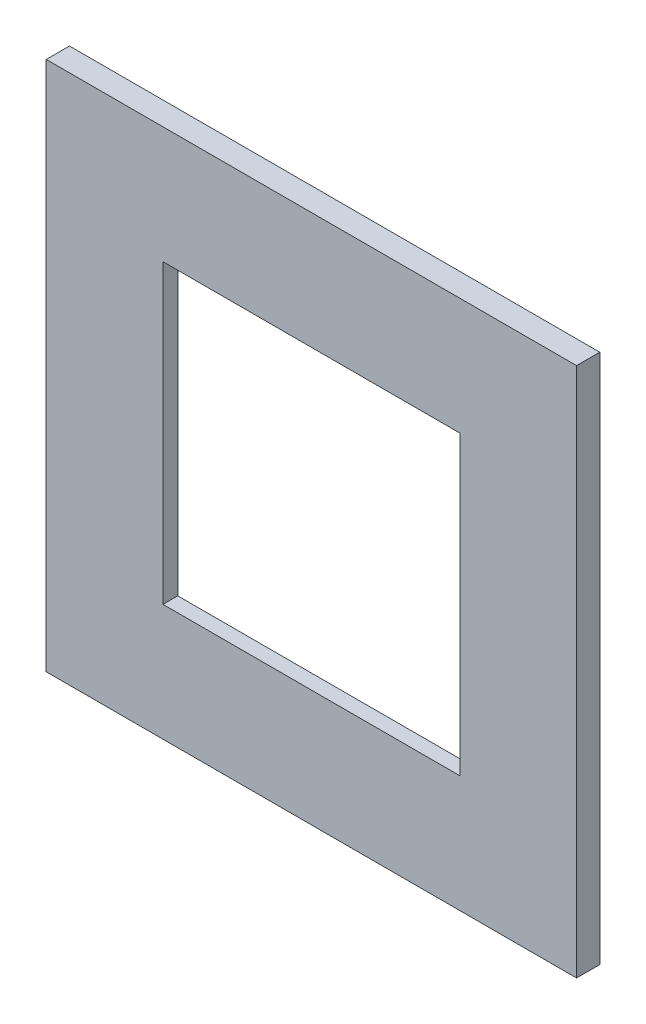
ISO-10303-21;
HEADER;
FILE_DESCRIPTION(('STEP AP214'),'2;1');
FILE_NAME('part.step','',(''),(''),'','','');
FILE_SCHEMA(('AUTOMOTIVE_DESIGN { 1 0 10303 214 1 1 1 1 }'));
ENDSEC;
DATA;
#1=APPLICATION_CONTEXT('core data for automotive mechanical design processes');
#2=APPLICATION_PROTOCOL_DEFINITION('international standard','automotive_design',2000,#1);
#3=PRODUCT_CONTEXT('',#1,'mechanical');
#4=PRODUCT('Part','Part','',(#3));
#5=PRODUCT_RELATED_PRODUCT_CATEGORY('part','',(#4));
#6=PRODUCT_DEFINITION_FORMATION('','',#4);
#7=PRODUCT_DEFINITION_CONTEXT('part definition',#1,'design');
#8=PRODUCT_DEFINITION('design','',#6,#7);
#9=PRODUCT_DEFINITION_SHAPE('','',#8);
#10=(LENGTH_UNIT() NAMED_UNIT(*) SI_UNIT(.MILLI.,.METRE.));
#11=(NAMED_UNIT(*) PLANE_ANGLE_UNIT() SI_UNIT($,.RADIAN.));
#12=(NAMED_UNIT(*) SI_UNIT($,.STERADIAN.) SOLID_ANGLE_UNIT());
#13=UNCERTAINTY_MEASURE_WITH_UNIT(LENGTH_MEASURE(1.E-05),#10,'distance_accuracy_value','');
#14=(GEOMETRIC_REPRESENTATION_CONTEXT(3) GLOBAL_UNCERTAINTY_ASSIGNED_CONTEXT((#13)) GLOBAL_UNIT_ASSIGNED_CONTEXT((#10,
#11,#12)) REPRESENTATION_CONTEXT('',''));
#15=CARTESIAN_POINT('',(0.,0.,0.));
#16=DIRECTION('',(0.,0.,1.));
#17=DIRECTION('',(1.,0.,0.));
#18=AXIS2_PLACEMENT_3D('',#15,#16,#17);
#19=CARTESIAN_POINT('',(41.1,82.2,-3.59999999999999));
#20=DIRECTION('',(-1.,0.,0.));
#21=DIRECTION('',(0.,0.,1.));
#22=AXIS2_PLACEMENT_3D('',#19,#20,#21);
#23=PLANE('',#22);
#24=DIRECTION('',(0.,0.,-1.));
#25=VECTOR('',#24,1.);
#26=CARTESIAN_POINT('',(41.1,0.,-3.59999999999999));
#27=LINE('',#26,#25);
#28=CARTESIAN_POINT('',(41.1,0.,0.));
#29=VERTEX_POINT('',#28);
#30=CARTESIAN_POINT('',(41.1,0.,-3.59999999999999));
#31=VERTEX_POINT('',#30);
#32=EDGE_CURVE('E240',#29,#31,#27,.T.);
#33=ORIENTED_EDGE('',*,*,#32,.T.);
#34=DIRECTION('',(0.,-1.,0.));
#35=VECTOR('',#34,1.);
#36=CARTESIAN_POINT('',(41.1,82.2,-3.59999999999999));
#37=LINE('',#36,#35);
#38=CARTESIAN_POINT('',(41.1,82.2,-3.59999999999999));
#39=VERTEX_POINT('',#38);
#40=EDGE_CURVE('E11',#39,#31,#37,.T.);
#41=ORIENTED_EDGE('',*,*,#40,.F.);
#42=DIRECTION('',(0.,0.,-1.));
#43=VECTOR('',#42,1.);
#44=CARTESIAN_POINT('',(41.1,82.2,-3.59999999999999));
#45=LINE('',#44,#43);
#46=CARTESIAN_POINT('',(41.1,82.2,0.));
#47=VERTEX_POINT('',#46);
#48=EDGE_CURVE('E251',#47,#39,#45,.T.);
#49=ORIENTED_EDGE('',*,*,#48,.F.);
#50=DIRECTION('',(0.,-1.,0.));
#51=VECTOR('',#50,1.);
#52=CARTESIAN_POINT('',(41.1,82.2,0.));
#53=LINE('',#52,#51);
#54=EDGE_CURVE('E261',#47,#29,#53,.T.);
#55=ORIENTED_EDGE('',*,*,#54,.T.);
#56=EDGE_LOOP('',(#33,#41,#49,#55));
#57=FACE_BOUND('',#56,.T.);
#58=ADVANCED_FACE('F37',(#57),#23,.F.);
#59=CARTESIAN_POINT('',(41.1,82.2,-3.59999999999999));
#60=DIRECTION('',(0.,0.,1.));
#61=DIRECTION('',(1.,0.,0.));
#62=AXIS2_PLACEMENT_3D('',#59,#60,#61);
#63=PLANE('',#62);
#64=DIRECTION('',(1.,0.,0.));
#65=VECTOR('',#64,1.);
#66=CARTESIAN_POINT('',(-38.2,79.3,-3.59999999999999));
#67=LINE('',#66,#65);
#68=CARTESIAN_POINT('',(-37.2,79.3,-3.59999999999999));
#69=VERTEX_POINT('',#68);
#70=CARTESIAN_POINT('',(37.2,79.3,-3.59999999999999));
#71=VERTEX_POINT('',#70);
#72=EDGE_CURVE('E231',#69,#71,#67,.T.);
#73=ORIENTED_EDGE('',*,*,#72,.F.);
#74=CARTESIAN_POINT('',(-38.2,79.3,-3.59999999999999));
#75=DIRECTION('',(0.,0.,-1.));
#76=DIRECTION('',(-1.,0.,0.));
#77=AXIS2_PLACEMENT_3D('',#74,#75,#76);
#78=CIRCLE('',#77,0.999999999999998);
#79=CARTESIAN_POINT('',(-38.2,78.3,-3.59999999999999));
#80=VERTEX_POINT('',#79);
#81=EDGE_CURVE('E193',#80,#69,#78,.T.);
#82=ORIENTED_EDGE('',*,*,#81,.F.);
#83=DIRECTION('',(0.,1.,0.));
#84=VECTOR('',#83,1.);
#85=CARTESIAN_POINT('',(-38.2,2.90000000000002,-3.59999999999999));
#86=LINE('',#85,#84);
#87=CARTESIAN_POINT('',(-38.2,3.90000000000002,-3.59999999999999));
#88=VERTEX_POINT('',#87);
#89=EDGE_CURVE('E246',#88,#80,#86,.T.);
#90=ORIENTED_EDGE('',*,*,#89,.F.);
#91=CARTESIAN_POINT('',(-38.2,2.90000000000002,-3.59999999999999));
#92=DIRECTION('',(0.,0.,-1.));
#93=DIRECTION('',(-1.,0.,0.));
#94=AXIS2_PLACEMENT_3D('',#91,#92,#93);
#95=CIRCLE('',#94,0.999999999999998);
#96=CARTESIAN_POINT('',(-37.2,2.90000000000002,-3.59999999999999));
#97=VERTEX_POINT('',#96);
#98=EDGE_CURVE('E196',#97,#88,#95,.T.);
#99=ORIENTED_EDGE('',*,*,#98,.F.);
#100=DIRECTION('',(-1.,0.,0.));
#101=VECTOR('',#100,1.);
#102=CARTESIAN_POINT('',(-38.2,2.90000000000002,-3.59999999999999));
#103=LINE('',#102,#101);
#104=CARTESIAN_POINT('',(37.2,2.90000000000001,-3.59999999999999));
#105=VERTEX_POINT('',#104);
#106=EDGE_CURVE('E243',#105,#97,#103,.T.);
#107=ORIENTED_EDGE('',*,*,#106,.F.);
#108=CARTESIAN_POINT('',(38.2,2.90000000000001,-3.59999999999999));
#109=DIRECTION('',(0.,0.,-1.));
#110=DIRECTION('',(-1.,0.,0.));
#111=AXIS2_PLACEMENT_3D('',#108,#109,#110);
#112=CIRCLE('',#111,0.999999999999998);
#113=CARTESIAN_POINT('',(38.2,3.90000000000001,-3.59999999999999));
#114=VERTEX_POINT('',#113);
#115=EDGE_CURVE('E194',#114,#105,#112,.T.);
#116=ORIENTED_EDGE('',*,*,#115,.F.);
#117=DIRECTION('',(0.,-1.,0.));
#118=VECTOR('',#117,1.);
#119=CARTESIAN_POINT('',(38.2,2.90000000000001,-3.59999999999999));
#120=LINE('',#119,#118);
#121=CARTESIAN_POINT('',(38.2,78.3,-3.59999999999999));
#122=VERTEX_POINT('',#121);
#123=EDGE_CURVE('E226',#122,#114,#120,.T.);
#124=ORIENTED_EDGE('',*,*,#123,.F.);
#125=CARTESIAN_POINT('',(38.2,79.3,-3.59999999999999));
#126=DIRECTION('',(0.,0.,-1.));
#127=DIRECTION('',(-1.,0.,0.));
#128=AXIS2_PLACEMENT_3D('',#125,#126,#127);
#129=CIRCLE('',#128,0.999999999999998);
#130=EDGE_CURVE('E188',#71,#122,#129,.T.);
#131=ORIENTED_EDGE('',*,*,#130,.F.);
#132=EDGE_LOOP('',(#73,#82,#90,#99,#107,#116,#124,#131));
#133=FACE_BOUND('',#132,.T.);
#134=DIRECTION('',(-1.,0.,0.));
#135=VECTOR('',#134,1.);
#136=CARTESIAN_POINT('',(41.1,0.,-3.59999999999999));
#137=LINE('',#136,#135);
#138=CARTESIAN_POINT('',(-41.1,0.,-3.59999999999999));
#139=VERTEX_POINT('',#138);
#140=EDGE_CURVE('E264',#31,#139,#137,.T.);
#141=ORIENTED_EDGE('',*,*,#140,.T.);
#142=DIRECTION('',(0.,-1.,0.));
#143=VECTOR('',#142,1.);
#144=CARTESIAN_POINT('',(-41.1,82.2,-3.59999999999999));
#145=LINE('',#144,#143);
#146=CARTESIAN_POINT('',(-41.1,82.2,-3.59999999999999));
#147=VERTEX_POINT('',#146);
#148=EDGE_CURVE('E44',#147,#139,#145,.T.);
#149=ORIENTED_EDGE('',*,*,#148,.F.);
#150=DIRECTION('',(-1.,0.,0.));
#151=VECTOR('',#150,1.);
#152=CARTESIAN_POINT('',(41.1,82.2,-3.59999999999999));
#153=LINE('',#152,#151);
#154=EDGE_CURVE('E254',#39,#147,#153,.T.);
#155=ORIENTED_EDGE('',*,*,#154,.F.);
#156=ORIENTED_EDGE('',*,*,#40,.T.);
#157=EDGE_LOOP('',(#141,#149,#155,#156));
#158=FACE_BOUND('',#157,.T.);
#159=ADVANCED_FACE('F292',(#133,#158),#63,.F.);
#160=CARTESIAN_POINT('',(-41.1,82.2,-3.59999999999999));
#161=DIRECTION('',(1.,0.,0.));
#162=DIRECTION('',(0.,0.,-1.));
#163=AXIS2_PLACEMENT_3D('',#160,#161,#162);
#164=PLANE('',#163);
#165=DIRECTION('',(0.,0.,1.));
#166=VECTOR('',#165,1.);
#167=CARTESIAN_POINT('',(-41.1,0.,-3.59999999999999));
#168=LINE('',#167,#166);
#169=CARTESIAN_POINT('',(-41.1,0.,0.));
#170=VERTEX_POINT('',#169);
#171=EDGE_CURVE('E266',#139,#170,#168,.T.);
#172=ORIENTED_EDGE('',*,*,#171,.T.);
#173=DIRECTION('',(0.,-1.,0.));
#174=VECTOR('',#173,1.);
#175=CARTESIAN_POINT('',(-41.1,82.2,0.));
#176=LINE('',#175,#174);
#177=CARTESIAN_POINT('',(-41.1,82.2,0.));
#178=VERTEX_POINT('',#177);
#179=EDGE_CURVE('E271',#178,#170,#176,.T.);
#180=ORIENTED_EDGE('',*,*,#179,.F.);
#181=DIRECTION('',(0.,0.,1.));
#182=VECTOR('',#181,1.);
#183=CARTESIAN_POINT('',(-41.1,82.2,-3.59999999999999));
#184=LINE('',#183,#182);
#185=EDGE_CURVE('E257',#147,#178,#184,.T.);
#186=ORIENTED_EDGE('',*,*,#185,.F.);
#187=ORIENTED_EDGE('',*,*,#148,.T.);
#188=EDGE_LOOP('',(#172,#180,#186,#187));
#189=FACE_BOUND('',#188,.T.);
#190=ADVANCED_FACE('F278',(#189),#164,.F.);
#191=CARTESIAN_POINT('',(-41.1,82.2,0.));
#192=DIRECTION('',(0.,0.,-1.));
#193=DIRECTION('',(-1.,0.,0.));
#194=AXIS2_PLACEMENT_3D('',#191,#192,#193);
#195=PLANE('',#194);
#196=DIRECTION('',(1.,0.,0.));
#197=VECTOR('',#196,1.);
#198=CARTESIAN_POINT('',(-23.,64.1,0.));
#199=LINE('',#198,#197);
#200=CARTESIAN_POINT('',(-23.,64.1,0.));
#201=VERTEX_POINT('',#200);
#202=CARTESIAN_POINT('',(23.,64.1,0.));
#203=VERTEX_POINT('',#202);
#204=EDGE_CURVE('E160',#201,#203,#199,.T.);
#205=ORIENTED_EDGE('',*,*,#204,.T.);
#206=DIRECTION('',(0.,-1.,0.));
#207=VECTOR('',#206,1.);
#208=CARTESIAN_POINT('',(23.,18.1,0.));
#209=LINE('',#208,#207);
#210=CARTESIAN_POINT('',(23.,18.1,0.));
#211=VERTEX_POINT('',#210);
#212=EDGE_CURVE('E152',#203,#211,#209,.T.);
#213=ORIENTED_EDGE('',*,*,#212,.T.);
#214=DIRECTION('',(-1.,0.,0.));
#215=VECTOR('',#214,1.);
#216=CARTESIAN_POINT('',(-23.,18.1,0.));
#217=LINE('',#216,#215);
#218=CARTESIAN_POINT('',(-23.,18.1,0.));
#219=VERTEX_POINT('',#218);
#220=EDGE_CURVE('E163',#211,#219,#217,.T.);
#221=ORIENTED_EDGE('',*,*,#220,.T.);
#222=DIRECTION('',(0.,1.,0.));
#223=VECTOR('',#222,1.);
#224=CARTESIAN_POINT('',(-23.,18.1,0.));
#225=LINE('',#224,#223);
#226=EDGE_CURVE('E56',#219,#201,#225,.T.);
#227=ORIENTED_EDGE('',*,*,#226,.T.);
#228=EDGE_LOOP('',(#205,#213,#221,#227));
#229=FACE_BOUND('',#228,.T.);
#230=DIRECTION('',(1.,0.,0.));
#231=VECTOR('',#230,1.);
#232=CARTESIAN_POINT('',(-41.1,0.,0.));
#233=LINE('',#232,#231);
#234=EDGE_CURVE('E255',#170,#29,#233,.T.);
#235=ORIENTED_EDGE('',*,*,#234,.T.);
#236=ORIENTED_EDGE('',*,*,#54,.F.);
#237=DIRECTION('',(1.,0.,0.));
#238=VECTOR('',#237,1.);
#239=CARTESIAN_POINT('',(-41.1,82.2,0.));
#240=LINE('',#239,#238);
#241=EDGE_CURVE('E259',#178,#47,#240,.T.);
#242=ORIENTED_EDGE('',*,*,#241,.F.);
#243=ORIENTED_EDGE('',*,*,#179,.T.);
#244=EDGE_LOOP('',(#235,#236,#242,#243));
#245=FACE_BOUND('',#244,.T.);
#246=ADVANCED_FACE('F167',(#229,#245),#195,.F.);
#247=CARTESIAN_POINT('',(0.,82.2,0.));
#248=DIRECTION('',(0.,1.,0.));
#249=DIRECTION('',(0.,0.,1.));
#250=AXIS2_PLACEMENT_3D('',#247,#248,#249);
#251=PLANE('',#250);
#252=ORIENTED_EDGE('',*,*,#48,.T.);
#253=ORIENTED_EDGE('',*,*,#154,.T.);
#254=ORIENTED_EDGE('',*,*,#185,.T.);
#255=ORIENTED_EDGE('',*,*,#241,.T.);
#256=EDGE_LOOP('',(#252,#253,#254,#255));
#257=FACE_BOUND('',#256,.T.);
#258=ADVANCED_FACE('F291',(#257),#251,.T.);
#259=CARTESIAN_POINT('',(0.,0.,0.));
#260=DIRECTION('',(0.,1.,0.));
#261=DIRECTION('',(0.,0.,1.));
#262=AXIS2_PLACEMENT_3D('',#259,#260,#261);
#263=PLANE('',#262);
#264=ORIENTED_EDGE('',*,*,#32,.F.);
#265=ORIENTED_EDGE('',*,*,#234,.F.);
#266=ORIENTED_EDGE('',*,*,#171,.F.);
#267=ORIENTED_EDGE('',*,*,#140,.F.);
#268=EDGE_LOOP('',(#264,#265,#266,#267));
#269=FACE_BOUND('',#268,.T.);
#270=ADVANCED_FACE('F284',(#269),#263,.F.);
#271=CARTESIAN_POINT('',(38.2,2.90000000000001,-2.28999999999999));
#272=DIRECTION('',(1.,0.,0.));
#273=DIRECTION('',(0.,0.,-1.));
#274=AXIS2_PLACEMENT_3D('',#271,#272,#273);
#275=PLANE('',#274);
#276=ORIENTED_EDGE('',*,*,#123,.T.);
#277=DIRECTION('',(0.,0.,-1.));
#278=VECTOR('',#277,1.);
#279=CARTESIAN_POINT('',(38.2,3.90000000000001,0.538427124746202));
#280=LINE('',#279,#278);
#281=CARTESIAN_POINT('',(38.2,3.90000000000001,-2.28999999999999));
#282=VERTEX_POINT('',#281);
#283=EDGE_CURVE('E217',#114,#282,#280,.F.);
#284=ORIENTED_EDGE('',*,*,#283,.T.);
#285=DIRECTION('',(0.,-1.,0.));
#286=VECTOR('',#285,1.);
#287=CARTESIAN_POINT('',(38.2,2.90000000000001,-2.28999999999999));
#288=LINE('',#287,#286);
#289=CARTESIAN_POINT('',(38.2,78.3,-2.28999999999999));
#290=VERTEX_POINT('',#289);
#291=EDGE_CURVE('E227',#290,#282,#288,.T.);
#292=ORIENTED_EDGE('',*,*,#291,.F.);
#293=DIRECTION('',(0.,0.,-1.));
#294=VECTOR('',#293,1.);
#295=CARTESIAN_POINT('',(38.2,78.3,0.538427124746202));
#296=LINE('',#295,#294);
#297=EDGE_CURVE('E211',#290,#122,#296,.T.);
#298=ORIENTED_EDGE('',*,*,#297,.T.);
#299=EDGE_LOOP('',(#276,#284,#292,#298));
#300=FACE_BOUND('',#299,.T.);
#301=ADVANCED_FACE('F306',(#300),#275,.F.);
#302=CARTESIAN_POINT('',(-38.2,79.3,-2.28999999999999));
#303=DIRECTION('',(0.,1.,0.));
#304=DIRECTION('',(0.,0.,1.));
#305=AXIS2_PLACEMENT_3D('',#302,#303,#304);
#306=PLANE('',#305);
#307=DIRECTION('',(1.,0.,0.));
#308=VECTOR('',#307,1.);
#309=CARTESIAN_POINT('',(-38.2,79.3,-2.28999999999999));
#310=LINE('',#309,#308);
#311=CARTESIAN_POINT('',(-37.2,79.3,-2.28999999999999));
#312=VERTEX_POINT('',#311);
#313=CARTESIAN_POINT('',(37.2,79.3,-2.28999999999999));
#314=VERTEX_POINT('',#313);
#315=EDGE_CURVE('E237',#312,#314,#310,.T.);
#316=ORIENTED_EDGE('',*,*,#315,.F.);
#317=DIRECTION('',(0.,0.,-1.));
#318=VECTOR('',#317,1.);
#319=CARTESIAN_POINT('',(-37.2,79.3,0.538427124746202));
#320=LINE('',#319,#318);
#321=EDGE_CURVE('E223',#312,#69,#320,.T.);
#322=ORIENTED_EDGE('',*,*,#321,.T.);
#323=ORIENTED_EDGE('',*,*,#72,.T.);
#324=DIRECTION('',(0.,0.,-1.));
#325=VECTOR('',#324,1.);
#326=CARTESIAN_POINT('',(37.2,79.3,0.538427124746202));
#327=LINE('',#326,#325);
#328=EDGE_CURVE('E208',#71,#314,#327,.F.);
#329=ORIENTED_EDGE('',*,*,#328,.T.);
#330=EDGE_LOOP('',(#316,#322,#323,#329));
#331=FACE_BOUND('',#330,.T.);
#332=ADVANCED_FACE('F311',(#331),#306,.F.);
#333=CARTESIAN_POINT('',(-38.2,2.90000000000002,-2.28999999999999));
#334=DIRECTION('',(-1.,0.,0.));
#335=DIRECTION('',(0.,0.,1.));
#336=AXIS2_PLACEMENT_3D('',#333,#334,#335);
#337=PLANE('',#336);
#338=ORIENTED_EDGE('',*,*,#89,.T.);
#339=DIRECTION('',(0.,0.,-1.));
#340=VECTOR('',#339,1.);
#341=CARTESIAN_POINT('',(-38.2,78.3,0.538427124746202));
#342=LINE('',#341,#340);
#343=CARTESIAN_POINT('',(-38.2,78.3,-2.28999999999999));
#344=VERTEX_POINT('',#343);
#345=EDGE_CURVE('E220',#80,#344,#342,.F.);
#346=ORIENTED_EDGE('',*,*,#345,.T.);
#347=DIRECTION('',(0.,1.,0.));
#348=VECTOR('',#347,1.);
#349=CARTESIAN_POINT('',(-38.2,2.90000000000002,-2.28999999999999));
#350=LINE('',#349,#348);
#351=CARTESIAN_POINT('',(-38.2,3.90000000000002,-2.28999999999999));
#352=VERTEX_POINT('',#351);
#353=EDGE_CURVE('E234',#352,#344,#350,.T.);
#354=ORIENTED_EDGE('',*,*,#353,.F.);
#355=DIRECTION('',(0.,0.,-1.));
#356=VECTOR('',#355,1.);
#357=CARTESIAN_POINT('',(-38.2,3.90000000000002,0.538427124746202));
#358=LINE('',#357,#356);
#359=EDGE_CURVE('E205',#352,#88,#358,.T.);
#360=ORIENTED_EDGE('',*,*,#359,.T.);
#361=EDGE_LOOP('',(#338,#346,#354,#360));
#362=FACE_BOUND('',#361,.T.);
#363=ADVANCED_FACE('F317',(#362),#337,.F.);
#364=CARTESIAN_POINT('',(-38.2,2.90000000000002,-2.28999999999999));
#365=DIRECTION('',(0.,-1.,0.));
#366=DIRECTION('',(1.,0.,0.));
#367=AXIS2_PLACEMENT_3D('',#364,#365,#366);
#368=PLANE('',#367);
#369=DIRECTION('',(-1.,0.,0.));
#370=VECTOR('',#369,1.);
#371=CARTESIAN_POINT('',(-38.2,2.90000000000002,-2.28999999999999));
#372=LINE('',#371,#370);
#373=CARTESIAN_POINT('',(37.2,2.90000000000001,-2.28999999999999));
#374=VERTEX_POINT('',#373);
#375=CARTESIAN_POINT('',(-37.2,2.90000000000002,-2.28999999999999));
#376=VERTEX_POINT('',#375);
#377=EDGE_CURVE('E230',#374,#376,#372,.T.);
#378=ORIENTED_EDGE('',*,*,#377,.F.);
#379=DIRECTION('',(0.,0.,-1.));
#380=VECTOR('',#379,1.);
#381=CARTESIAN_POINT('',(37.2,2.90000000000001,0.538427124746202));
#382=LINE('',#381,#380);
#383=EDGE_CURVE('E214',#374,#105,#382,.T.);
#384=ORIENTED_EDGE('',*,*,#383,.T.);
#385=ORIENTED_EDGE('',*,*,#106,.T.);
#386=DIRECTION('',(0.,0.,-1.));
#387=VECTOR('',#386,1.);
#388=CARTESIAN_POINT('',(-37.2,2.90000000000002,0.538427124746202));
#389=LINE('',#388,#387);
#390=EDGE_CURVE('E202',#97,#376,#389,.F.);
#391=ORIENTED_EDGE('',*,*,#390,.T.);
#392=EDGE_LOOP('',(#378,#384,#385,#391));
#393=FACE_BOUND('',#392,.T.);
#394=ADVANCED_FACE('F313',(#393),#368,.F.);
#395=CARTESIAN_POINT('',(0.,0.,-2.28999999999999));
#396=DIRECTION('',(0.,0.,-1.));
#397=DIRECTION('',(-1.,0.,0.));
#398=AXIS2_PLACEMENT_3D('',#395,#396,#397);
#399=PLANE('',#398);
#400=DIRECTION('',(0.,-1.,0.));
#401=VECTOR('',#400,1.);
#402=CARTESIAN_POINT('',(23.,18.1,-2.28999999999999));
#403=LINE('',#402,#401);
#404=CARTESIAN_POINT('',(23.,64.1,-2.28999999999999));
#405=VERTEX_POINT('',#404);
#406=CARTESIAN_POINT('',(23.,18.1,-2.28999999999999));
#407=VERTEX_POINT('',#406);
#408=EDGE_CURVE('E155',#405,#407,#403,.T.);
#409=ORIENTED_EDGE('',*,*,#408,.F.);
#410=DIRECTION('',(1.,0.,0.));
#411=VECTOR('',#410,1.);
#412=CARTESIAN_POINT('',(-23.,64.1,-2.28999999999999));
#413=LINE('',#412,#411);
#414=CARTESIAN_POINT('',(-23.,64.1,-2.28999999999999));
#415=VERTEX_POINT('',#414);
#416=EDGE_CURVE('E170',#415,#405,#413,.T.);
#417=ORIENTED_EDGE('',*,*,#416,.F.);
#418=DIRECTION('',(0.,1.,0.));
#419=VECTOR('',#418,1.);
#420=CARTESIAN_POINT('',(-23.,18.1,-2.28999999999999));
#421=LINE('',#420,#419);
#422=CARTESIAN_POINT('',(-23.,18.1,-2.28999999999999));
#423=VERTEX_POINT('',#422);
#424=EDGE_CURVE('E51',#423,#415,#421,.T.);
#425=ORIENTED_EDGE('',*,*,#424,.F.);
#426=DIRECTION('',(-1.,0.,0.));
#427=VECTOR('',#426,1.);
#428=CARTESIAN_POINT('',(-23.,18.1,-2.28999999999999));
#429=LINE('',#428,#427);
#430=EDGE_CURVE('E178',#407,#423,#429,.T.);
#431=ORIENTED_EDGE('',*,*,#430,.F.);
#432=EDGE_LOOP('',(#409,#417,#425,#431));
#433=FACE_BOUND('',#432,.T.);
#434=CARTESIAN_POINT('',(38.2,79.3,-2.28999999999999));
#435=DIRECTION('',(0.,0.,-1.));
#436=DIRECTION('',(-1.,0.,0.));
#437=AXIS2_PLACEMENT_3D('',#434,#435,#436);
#438=CIRCLE('',#437,0.999999999999998);
#439=EDGE_CURVE('E183',#290,#314,#438,.F.);
#440=ORIENTED_EDGE('',*,*,#439,.F.);
#441=ORIENTED_EDGE('',*,*,#291,.T.);
#442=CARTESIAN_POINT('',(38.2,2.90000000000001,-2.28999999999999));
#443=DIRECTION('',(0.,0.,-1.));
#444=DIRECTION('',(-1.,0.,0.));
#445=AXIS2_PLACEMENT_3D('',#442,#443,#444);
#446=CIRCLE('',#445,0.999999999999998);
#447=EDGE_CURVE('E190',#374,#282,#446,.F.);
#448=ORIENTED_EDGE('',*,*,#447,.F.);
#449=ORIENTED_EDGE('',*,*,#377,.T.);
#450=CARTESIAN_POINT('',(-38.2,2.90000000000002,-2.28999999999999));
#451=DIRECTION('',(0.,0.,-1.));
#452=DIRECTION('',(-1.,0.,0.));
#453=AXIS2_PLACEMENT_3D('',#450,#451,#452);
#454=CIRCLE('',#453,0.999999999999998);
#455=EDGE_CURVE('E200',#352,#376,#454,.F.);
#456=ORIENTED_EDGE('',*,*,#455,.F.);
#457=ORIENTED_EDGE('',*,*,#353,.T.);
#458=CARTESIAN_POINT('',(-38.2,79.3,-2.28999999999999));
#459=DIRECTION('',(0.,0.,-1.));
#460=DIRECTION('',(-1.,0.,0.));
#461=AXIS2_PLACEMENT_3D('',#458,#459,#460);
#462=CIRCLE('',#461,0.999999999999998);
#463=EDGE_CURVE('E191',#312,#344,#462,.F.);
#464=ORIENTED_EDGE('',*,*,#463,.F.);
#465=ORIENTED_EDGE('',*,*,#315,.T.);
#466=EDGE_LOOP('',(#440,#441,#448,#449,#456,#457,#464,#465));
#467=FACE_BOUND('',#466,.T.);
#468=ADVANCED_FACE('F316',(#433,#467),#399,.T.);
#469=CARTESIAN_POINT('',(-38.2,2.90000000000002,0.538427124746202));
#470=DIRECTION('',(0.,0.,-1.));
#471=DIRECTION('',(-1.,0.,0.));
#472=AXIS2_PLACEMENT_3D('',#469,#470,#471);
#473=CYLINDRICAL_SURFACE('',#472,0.999999999999998);
#474=ORIENTED_EDGE('',*,*,#455,.T.);
#475=ORIENTED_EDGE('',*,*,#390,.F.);
#476=ORIENTED_EDGE('',*,*,#98,.T.);
#477=ORIENTED_EDGE('',*,*,#359,.F.);
#478=EDGE_LOOP('',(#474,#475,#476,#477));
#479=FACE_BOUND('',#478,.T.);
#480=ADVANCED_FACE('F327',(#479),#473,.F.);
#481=CARTESIAN_POINT('',(38.2,2.90000000000001,0.538427124746202));
#482=DIRECTION('',(0.,0.,-1.));
#483=DIRECTION('',(-1.,0.,0.));
#484=AXIS2_PLACEMENT_3D('',#481,#482,#483);
#485=CYLINDRICAL_SURFACE('',#484,0.999999999999998);
#486=ORIENTED_EDGE('',*,*,#115,.T.);
#487=ORIENTED_EDGE('',*,*,#383,.F.);
#488=ORIENTED_EDGE('',*,*,#447,.T.);
#489=ORIENTED_EDGE('',*,*,#283,.F.);
#490=EDGE_LOOP('',(#486,#487,#488,#489));
#491=FACE_BOUND('',#490,.T.);
#492=ADVANCED_FACE('F331',(#491),#485,.F.);
#493=CARTESIAN_POINT('',(-38.2,79.3,0.538427124746202));
#494=DIRECTION('',(0.,0.,-1.));
#495=DIRECTION('',(-1.,0.,0.));
#496=AXIS2_PLACEMENT_3D('',#493,#494,#495);
#497=CYLINDRICAL_SURFACE('',#496,0.999999999999998);
#498=ORIENTED_EDGE('',*,*,#463,.T.);
#499=ORIENTED_EDGE('',*,*,#345,.F.);
#500=ORIENTED_EDGE('',*,*,#81,.T.);
#501=ORIENTED_EDGE('',*,*,#321,.F.);
#502=EDGE_LOOP('',(#498,#499,#500,#501));
#503=FACE_BOUND('',#502,.T.);
#504=ADVANCED_FACE('F335',(#503),#497,.F.);
#505=CARTESIAN_POINT('',(38.2,79.3,0.538427124746202));
#506=DIRECTION('',(0.,0.,-1.));
#507=DIRECTION('',(-1.,0.,0.));
#508=AXIS2_PLACEMENT_3D('',#505,#506,#507);
#509=CYLINDRICAL_SURFACE('',#508,0.999999999999998);
#510=ORIENTED_EDGE('',*,*,#439,.T.);
#511=ORIENTED_EDGE('',*,*,#328,.F.);
#512=ORIENTED_EDGE('',*,*,#130,.T.);
#513=ORIENTED_EDGE('',*,*,#297,.F.);
#514=EDGE_LOOP('',(#510,#511,#512,#513));
#515=FACE_BOUND('',#514,.T.);
#516=ADVANCED_FACE('F339',(#515),#509,.F.);
#517=CARTESIAN_POINT('',(23.,18.1,0.));
#518=DIRECTION('',(1.,0.,0.));
#519=DIRECTION('',(0.,0.,-1.));
#520=AXIS2_PLACEMENT_3D('',#517,#518,#519);
#521=PLANE('',#520);
#522=ORIENTED_EDGE('',*,*,#408,.T.);
#523=DIRECTION('',(0.,0.,-1.));
#524=VECTOR('',#523,1.);
#525=CARTESIAN_POINT('',(23.,18.1,0.));
#526=LINE('',#525,#524);
#527=EDGE_CURVE('E148',#211,#407,#526,.T.);
#528=ORIENTED_EDGE('',*,*,#527,.F.);
#529=ORIENTED_EDGE('',*,*,#212,.F.);
#530=DIRECTION('',(0.,0.,-1.));
#531=VECTOR('',#530,1.);
#532=CARTESIAN_POINT('',(23.,64.1,0.));
#533=LINE('',#532,#531);
#534=EDGE_CURVE('E181',#203,#405,#533,.T.);
#535=ORIENTED_EDGE('',*,*,#534,.T.);
#536=EDGE_LOOP('',(#522,#528,#529,#535));
#537=FACE_BOUND('',#536,.T.);
#538=ADVANCED_FACE('F150',(#537),#521,.F.);
#539=CARTESIAN_POINT('',(-23.,64.1,0.));
#540=DIRECTION('',(0.,1.,0.));
#541=DIRECTION('',(-1.,0.,0.));
#542=AXIS2_PLACEMENT_3D('',#539,#540,#541);
#543=PLANE('',#542);
#544=ORIENTED_EDGE('',*,*,#416,.T.);
#545=ORIENTED_EDGE('',*,*,#534,.F.);
#546=ORIENTED_EDGE('',*,*,#204,.F.);
#547=DIRECTION('',(0.,0.,-1.));
#548=VECTOR('',#547,1.);
#549=CARTESIAN_POINT('',(-23.,64.1,0.));
#550=LINE('',#549,#548);
#551=EDGE_CURVE('E184',#201,#415,#550,.T.);
#552=ORIENTED_EDGE('',*,*,#551,.T.);
#553=EDGE_LOOP('',(#544,#545,#546,#552));
#554=FACE_BOUND('',#553,.T.);
#555=ADVANCED_FACE('F346',(#554),#543,.F.);
#556=CARTESIAN_POINT('',(-23.,18.1,0.));
#557=DIRECTION('',(-1.,0.,0.));
#558=DIRECTION('',(0.,0.,1.));
#559=AXIS2_PLACEMENT_3D('',#556,#557,#558);
#560=PLANE('',#559);
#561=ORIENTED_EDGE('',*,*,#424,.T.);
#562=ORIENTED_EDGE('',*,*,#551,.F.);
#563=ORIENTED_EDGE('',*,*,#226,.F.);
#564=DIRECTION('',(0.,0.,-1.));
#565=VECTOR('',#564,1.);
#566=CARTESIAN_POINT('',(-23.,18.1,0.));
#567=LINE('',#566,#565);
#568=EDGE_CURVE('E159',#219,#423,#567,.T.);
#569=ORIENTED_EDGE('',*,*,#568,.T.);
#570=EDGE_LOOP('',(#561,#562,#563,#569));
#571=FACE_BOUND('',#570,.T.);
#572=ADVANCED_FACE('F349',(#571),#560,.F.);
#573=CARTESIAN_POINT('',(-23.,18.1,0.));
#574=DIRECTION('',(0.,-1.,0.));
#575=DIRECTION('',(1.,0.,0.));
#576=AXIS2_PLACEMENT_3D('',#573,#574,#575);
#577=PLANE('',#576);
#578=ORIENTED_EDGE('',*,*,#430,.T.);
#579=ORIENTED_EDGE('',*,*,#568,.F.);
#580=ORIENTED_EDGE('',*,*,#220,.F.);
#581=ORIENTED_EDGE('',*,*,#527,.T.);
#582=EDGE_LOOP('',(#578,#579,#580,#581));
#583=FACE_BOUND('',#582,.T.);
#584=ADVANCED_FACE('F164',(#583),#577,.F.);
#585=CLOSED_SHELL('',(#58,#159,#190,#246,#258,#270,#301,#332,#363,#394,#468,#480,#492,#504,#516,
#538,#555,#572,#584));
#586=MANIFOLD_SOLID_BREP('B2',#585);
#587=ADVANCED_BREP_SHAPE_REPRESENTATION('',(#18,#586),#14);
#588=SHAPE_DEFINITION_REPRESENTATION(#9,#587);
ENDSEC;
END-ISO-10303-21;
